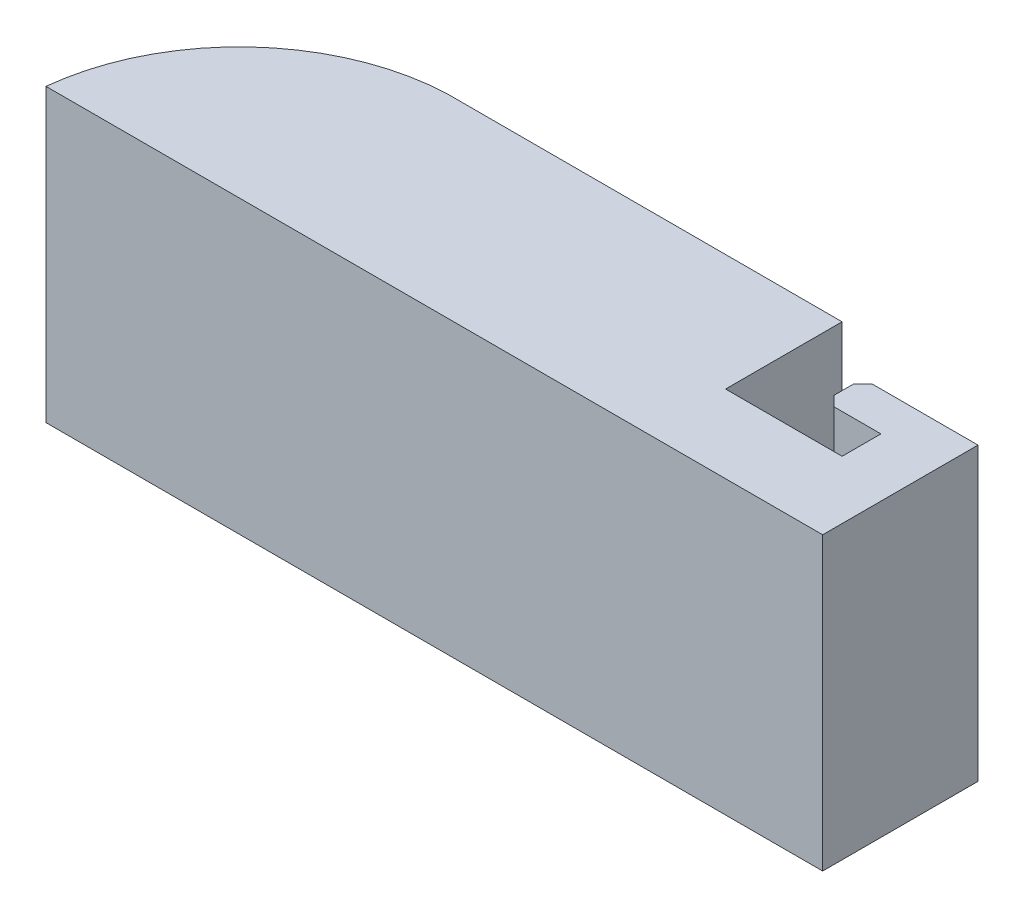
ISO-10303-21;
HEADER;
FILE_DESCRIPTION(('STEP AP214'),'2;1');
FILE_NAME('part.step','',(''),(''),'','','');
FILE_SCHEMA(('AUTOMOTIVE_DESIGN { 1 0 10303 214 1 1 1 1 }'));
ENDSEC;
DATA;
#1=APPLICATION_CONTEXT('core data for automotive mechanical design processes');
#2=APPLICATION_PROTOCOL_DEFINITION('international standard','automotive_design',2000,#1);
#3=PRODUCT_CONTEXT('',#1,'mechanical');
#4=PRODUCT('Part','Part','',(#3));
#5=PRODUCT_RELATED_PRODUCT_CATEGORY('part','',(#4));
#6=PRODUCT_DEFINITION_FORMATION('','',#4);
#7=PRODUCT_DEFINITION_CONTEXT('part definition',#1,'design');
#8=PRODUCT_DEFINITION('design','',#6,#7);
#9=PRODUCT_DEFINITION_SHAPE('','',#8);
#10=(LENGTH_UNIT() NAMED_UNIT(*) SI_UNIT(.MILLI.,.METRE.));
#11=(NAMED_UNIT(*) PLANE_ANGLE_UNIT() SI_UNIT($,.RADIAN.));
#12=(NAMED_UNIT(*) SI_UNIT($,.STERADIAN.) SOLID_ANGLE_UNIT());
#13=UNCERTAINTY_MEASURE_WITH_UNIT(LENGTH_MEASURE(1.E-05),#10,'distance_accuracy_value','');
#14=(GEOMETRIC_REPRESENTATION_CONTEXT(3) GLOBAL_UNCERTAINTY_ASSIGNED_CONTEXT((#13)) GLOBAL_UNIT_ASSIGNED_CONTEXT((#10,
#11,#12)) REPRESENTATION_CONTEXT('',''));
#15=CARTESIAN_POINT('',(0.,0.,0.));
#16=DIRECTION('',(0.,0.,1.));
#17=DIRECTION('',(1.,0.,0.));
#18=AXIS2_PLACEMENT_3D('',#15,#16,#17);
#19=CARTESIAN_POINT('',(0.,15.,0.));
#20=DIRECTION('',(0.,0.,-1.));
#21=DIRECTION('',(-1.,0.,0.));
#22=AXIS2_PLACEMENT_3D('',#19,#20,#21);
#23=PLANE('',#22);
#24=DIRECTION('',(1.,0.,0.));
#25=VECTOR('',#24,1.);
#26=CARTESIAN_POINT('',(0.,0.,0.));
#27=LINE('',#26,#25);
#28=CARTESIAN_POINT('',(0.,0.,0.));
#29=VERTEX_POINT('',#28);
#30=CARTESIAN_POINT('',(40.,0.,0.));
#31=VERTEX_POINT('',#30);
#32=EDGE_CURVE('E171',#29,#31,#27,.T.);
#33=ORIENTED_EDGE('',*,*,#32,.T.);
#34=DIRECTION('',(0.,-1.,0.));
#35=VECTOR('',#34,1.);
#36=CARTESIAN_POINT('',(40.,15.,0.));
#37=LINE('',#36,#35);
#38=CARTESIAN_POINT('',(40.,15.,0.));
#39=VERTEX_POINT('',#38);
#40=EDGE_CURVE('E175',#39,#31,#37,.T.);
#41=ORIENTED_EDGE('',*,*,#40,.F.);
#42=DIRECTION('',(1.,0.,0.));
#43=VECTOR('',#42,1.);
#44=CARTESIAN_POINT('',(0.,15.,0.));
#45=LINE('',#44,#43);
#46=CARTESIAN_POINT('',(0.,15.,0.));
#47=VERTEX_POINT('',#46);
#48=EDGE_CURVE('E163',#47,#39,#45,.T.);
#49=ORIENTED_EDGE('',*,*,#48,.F.);
#50=DIRECTION('',(0.,-1.,0.));
#51=VECTOR('',#50,1.);
#52=CARTESIAN_POINT('',(0.,15.,0.));
#53=LINE('',#52,#51);
#54=EDGE_CURVE('E179',#47,#29,#53,.T.);
#55=ORIENTED_EDGE('',*,*,#54,.T.);
#56=EDGE_LOOP('',(#33,#41,#49,#55));
#57=FACE_BOUND('',#56,.T.);
#58=ADVANCED_FACE('F41',(#57),#23,.F.);
#59=CARTESIAN_POINT('',(40.,15.,0.));
#60=DIRECTION('',(-1.,0.,0.));
#61=DIRECTION('',(0.,0.,1.));
#62=AXIS2_PLACEMENT_3D('',#59,#60,#61);
#63=PLANE('',#62);
#64=DIRECTION('',(0.,0.,-1.));
#65=VECTOR('',#64,1.);
#66=CARTESIAN_POINT('',(40.,0.,0.));
#67=LINE('',#66,#65);
#68=CARTESIAN_POINT('',(40.,0.,-8.));
#69=VERTEX_POINT('',#68);
#70=EDGE_CURVE('E164',#31,#69,#67,.T.);
#71=ORIENTED_EDGE('',*,*,#70,.T.);
#72=DIRECTION('',(0.,1.,0.));
#73=VECTOR('',#72,1.);
#74=CARTESIAN_POINT('',(40.,0.,-8.));
#75=LINE('',#74,#73);
#76=CARTESIAN_POINT('',(40.,15.,-8.));
#77=VERTEX_POINT('',#76);
#78=EDGE_CURVE('E213',#69,#77,#75,.T.);
#79=ORIENTED_EDGE('',*,*,#78,.T.);
#80=DIRECTION('',(0.,0.,-1.));
#81=VECTOR('',#80,1.);
#82=CARTESIAN_POINT('',(40.,15.,0.));
#83=LINE('',#82,#81);
#84=EDGE_CURVE('E168',#39,#77,#83,.T.);
#85=ORIENTED_EDGE('',*,*,#84,.F.);
#86=ORIENTED_EDGE('',*,*,#40,.T.);
#87=EDGE_LOOP('',(#71,#79,#85,#86));
#88=FACE_BOUND('',#87,.T.);
#89=ADVANCED_FACE('F262',(#88),#63,.F.);
#90=CARTESIAN_POINT('',(0.,15.,-10.));
#91=DIRECTION('',(0.,0.,1.));
#92=DIRECTION('',(1.,0.,0.));
#93=AXIS2_PLACEMENT_3D('',#90,#91,#92);
#94=PLANE('',#93);
#95=DIRECTION('',(-1.,0.,0.));
#96=VECTOR('',#95,1.);
#97=CARTESIAN_POINT('',(0.,15.,-10.));
#98=LINE('',#97,#96);
#99=CARTESIAN_POINT('',(31.,15.,-10.));
#100=VERTEX_POINT('',#99);
#101=CARTESIAN_POINT('',(10.6638408238679,15.,-10.));
#102=VERTEX_POINT('',#101);
#103=EDGE_CURVE('E154',#100,#102,#98,.T.);
#104=ORIENTED_EDGE('',*,*,#103,.F.);
#105=DIRECTION('',(0.,1.,0.));
#106=VECTOR('',#105,1.);
#107=CARTESIAN_POINT('',(31.,0.,-10.));
#108=LINE('',#107,#106);
#109=CARTESIAN_POINT('',(31.,0.,-10.));
#110=VERTEX_POINT('',#109);
#111=EDGE_CURVE('E138',#110,#100,#108,.T.);
#112=ORIENTED_EDGE('',*,*,#111,.F.);
#113=DIRECTION('',(-1.,0.,0.));
#114=VECTOR('',#113,1.);
#115=CARTESIAN_POINT('',(0.,0.,-10.));
#116=LINE('',#115,#114);
#117=CARTESIAN_POINT('',(10.6638408238679,0.,-10.));
#118=VERTEX_POINT('',#117);
#119=EDGE_CURVE('E152',#110,#118,#116,.T.);
#120=ORIENTED_EDGE('',*,*,#119,.T.);
#121=DIRECTION('',(0.,1.,0.));
#122=VECTOR('',#121,1.);
#123=CARTESIAN_POINT('',(10.6638408238679,0.,-10.));
#124=LINE('',#123,#122);
#125=EDGE_CURVE('E247',#118,#102,#124,.T.);
#126=ORIENTED_EDGE('',*,*,#125,.T.);
#127=EDGE_LOOP('',(#104,#112,#120,#126));
#128=FACE_BOUND('',#127,.T.);
#129=ADVANCED_FACE('F150',(#128),#94,.F.);
#130=CARTESIAN_POINT('',(0.,15.,0.));
#131=DIRECTION('',(0.,-1.,0.));
#132=DIRECTION('',(0.,0.,-1.));
#133=AXIS2_PLACEMENT_3D('',#130,#131,#132);
#134=PLANE('',#133);
#135=DIRECTION('',(1.,0.,0.));
#136=VECTOR('',#135,1.);
#137=CARTESIAN_POINT('',(34.0714996686127,15.,-8.));
#138=LINE('',#137,#136);
#139=CARTESIAN_POINT('',(34.5714996686127,15.,-8.));
#140=VERTEX_POINT('',#139);
#141=EDGE_CURVE('E146',#140,#77,#138,.T.);
#142=ORIENTED_EDGE('',*,*,#141,.F.);
#143=DIRECTION('',(0.707106781186548,0.,-0.707106781186548));
#144=VECTOR('',#143,1.);
#145=CARTESIAN_POINT('',(34.5714996686127,15.,-8.));
#146=LINE('',#145,#144);
#147=CARTESIAN_POINT('',(34.0714996686127,15.,-7.5));
#148=VERTEX_POINT('',#147);
#149=EDGE_CURVE('E190',#140,#148,#146,.F.);
#150=ORIENTED_EDGE('',*,*,#149,.T.);
#151=DIRECTION('',(0.,0.,-1.));
#152=VECTOR('',#151,1.);
#153=CARTESIAN_POINT('',(34.0714996686127,15.,-6.));
#154=LINE('',#153,#152);
#155=CARTESIAN_POINT('',(34.0714996686127,15.,-6.49999999999999));
#156=VERTEX_POINT('',#155);
#157=EDGE_CURVE('E220',#156,#148,#154,.T.);
#158=ORIENTED_EDGE('',*,*,#157,.F.);
#159=DIRECTION('',(-0.707106781186552,0.,-0.707106781186543));
#160=VECTOR('',#159,1.);
#161=CARTESIAN_POINT('',(34.0714996686127,15.,-6.49999999999999));
#162=LINE('',#161,#160);
#163=CARTESIAN_POINT('',(34.5714996686127,15.,-6.));
#164=VERTEX_POINT('',#163);
#165=EDGE_CURVE('E187',#156,#164,#162,.F.);
#166=ORIENTED_EDGE('',*,*,#165,.T.);
#167=DIRECTION('',(-1.,0.,0.));
#168=VECTOR('',#167,1.);
#169=CARTESIAN_POINT('',(37.,15.,-6.));
#170=LINE('',#169,#168);
#171=CARTESIAN_POINT('',(37.,15.,-6.));
#172=VERTEX_POINT('',#171);
#173=EDGE_CURVE('E225',#172,#164,#170,.T.);
#174=ORIENTED_EDGE('',*,*,#173,.F.);
#175=DIRECTION('',(0.,0.,-1.));
#176=VECTOR('',#175,1.);
#177=CARTESIAN_POINT('',(37.,15.,-4.));
#178=LINE('',#177,#176);
#179=CARTESIAN_POINT('',(37.,15.,-4.));
#180=VERTEX_POINT('',#179);
#181=EDGE_CURVE('E230',#180,#172,#178,.T.);
#182=ORIENTED_EDGE('',*,*,#181,.F.);
#183=DIRECTION('',(1.,0.,0.));
#184=VECTOR('',#183,1.);
#185=CARTESIAN_POINT('',(31.,15.,-4.));
#186=LINE('',#185,#184);
#187=CARTESIAN_POINT('',(31.,15.,-4.));
#188=VERTEX_POINT('',#187);
#189=EDGE_CURVE('E401',#188,#180,#186,.T.);
#190=ORIENTED_EDGE('',*,*,#189,.F.);
#191=DIRECTION('',(0.,0.,1.));
#192=VECTOR('',#191,1.);
#193=CARTESIAN_POINT('',(31.,15.,-10.));
#194=LINE('',#193,#192);
#195=EDGE_CURVE('E398',#100,#188,#194,.T.);
#196=ORIENTED_EDGE('',*,*,#195,.F.);
#197=ORIENTED_EDGE('',*,*,#103,.T.);
#198=CARTESIAN_POINT('',(11.1116441513497,15.,1.16340539630602));
#199=DIRECTION('',(0.,-1.,0.));
#200=DIRECTION('',(0.,0.,-1.));
#201=AXIS2_PLACEMENT_3D('',#198,#199,#200);
#202=CIRCLE('',#201,11.1723832668942);
#203=EDGE_CURVE('E236',#47,#102,#202,.T.);
#204=ORIENTED_EDGE('',*,*,#203,.F.);
#205=ORIENTED_EDGE('',*,*,#48,.T.);
#206=ORIENTED_EDGE('',*,*,#84,.T.);
#207=EDGE_LOOP('',(#142,#150,#158,#166,#174,#182,#190,#196,#197,#204,#205,#206));
#208=FACE_BOUND('',#207,.T.);
#209=ADVANCED_FACE('F219',(#208),#134,.F.);
#210=CARTESIAN_POINT('',(0.,0.,0.));
#211=DIRECTION('',(0.,-1.,0.));
#212=DIRECTION('',(0.,0.,-1.));
#213=AXIS2_PLACEMENT_3D('',#210,#211,#212);
#214=PLANE('',#213);
#215=DIRECTION('',(0.,0.,-1.));
#216=VECTOR('',#215,1.);
#217=CARTESIAN_POINT('',(34.0714996686127,0.,-6.));
#218=LINE('',#217,#216);
#219=CARTESIAN_POINT('',(34.0714996686127,0.,-6.49999999999999));
#220=VERTEX_POINT('',#219);
#221=CARTESIAN_POINT('',(34.0714996686127,0.,-7.5));
#222=VERTEX_POINT('',#221);
#223=EDGE_CURVE('E206',#220,#222,#218,.T.);
#224=ORIENTED_EDGE('',*,*,#223,.T.);
#225=DIRECTION('',(-0.707106781186548,0.,0.707106781186548));
#226=VECTOR('',#225,1.);
#227=CARTESIAN_POINT('',(13.2857498343064,0.,13.2857498343064));
#228=LINE('',#227,#226);
#229=CARTESIAN_POINT('',(34.5714996686127,0.,-8.));
#230=VERTEX_POINT('',#229);
#231=EDGE_CURVE('E51',#222,#230,#228,.F.);
#232=ORIENTED_EDGE('',*,*,#231,.T.);
#233=DIRECTION('',(1.,0.,0.));
#234=VECTOR('',#233,1.);
#235=CARTESIAN_POINT('',(34.0714996686127,0.,-8.));
#236=LINE('',#235,#234);
#237=EDGE_CURVE('E156',#230,#69,#236,.T.);
#238=ORIENTED_EDGE('',*,*,#237,.T.);
#239=ORIENTED_EDGE('',*,*,#70,.F.);
#240=ORIENTED_EDGE('',*,*,#32,.F.);
#241=CARTESIAN_POINT('',(11.1116441513497,0.,1.16340539630602));
#242=DIRECTION('',(0.,-1.,0.));
#243=DIRECTION('',(0.,0.,-1.));
#244=AXIS2_PLACEMENT_3D('',#241,#242,#243);
#245=CIRCLE('',#244,11.1723832668942);
#246=EDGE_CURVE('E161',#29,#118,#245,.T.);
#247=ORIENTED_EDGE('',*,*,#246,.T.);
#248=ORIENTED_EDGE('',*,*,#119,.F.);
#249=DIRECTION('',(0.,0.,1.));
#250=VECTOR('',#249,1.);
#251=CARTESIAN_POINT('',(31.,0.,-10.));
#252=LINE('',#251,#250);
#253=CARTESIAN_POINT('',(31.,0.,-4.));
#254=VERTEX_POINT('',#253);
#255=EDGE_CURVE('E134',#110,#254,#252,.T.);
#256=ORIENTED_EDGE('',*,*,#255,.T.);
#257=DIRECTION('',(1.,0.,0.));
#258=VECTOR('',#257,1.);
#259=CARTESIAN_POINT('',(31.,0.,-4.));
#260=LINE('',#259,#258);
#261=CARTESIAN_POINT('',(37.,0.,-4.));
#262=VERTEX_POINT('',#261);
#263=EDGE_CURVE('E145',#254,#262,#260,.T.);
#264=ORIENTED_EDGE('',*,*,#263,.T.);
#265=DIRECTION('',(0.,0.,-1.));
#266=VECTOR('',#265,1.);
#267=CARTESIAN_POINT('',(37.,0.,-4.));
#268=LINE('',#267,#266);
#269=CARTESIAN_POINT('',(37.,0.,-6.));
#270=VERTEX_POINT('',#269);
#271=EDGE_CURVE('E394',#262,#270,#268,.T.);
#272=ORIENTED_EDGE('',*,*,#271,.T.);
#273=DIRECTION('',(-1.,0.,0.));
#274=VECTOR('',#273,1.);
#275=CARTESIAN_POINT('',(37.,0.,-6.));
#276=LINE('',#275,#274);
#277=CARTESIAN_POINT('',(34.5714996686127,0.,-6.));
#278=VERTEX_POINT('',#277);
#279=EDGE_CURVE('E390',#270,#278,#276,.T.);
#280=ORIENTED_EDGE('',*,*,#279,.T.);
#281=DIRECTION('',(0.707106781186552,0.,0.707106781186543));
#282=VECTOR('',#281,1.);
#283=CARTESIAN_POINT('',(20.2857498343061,0.,-20.2857498343064));
#284=LINE('',#283,#282);
#285=EDGE_CURVE('E199',#278,#220,#284,.F.);
#286=ORIENTED_EDGE('',*,*,#285,.T.);
#287=EDGE_LOOP('',(#224,#232,#238,#239,#240,#247,#248,#256,#264,#272,#280,#286));
#288=FACE_BOUND('',#287,.T.);
#289=ADVANCED_FACE('F159',(#288),#214,.T.);
#290=CARTESIAN_POINT('',(11.1116441513497,0.,1.16340539630602));
#291=DIRECTION('',(0.,1.,0.));
#292=DIRECTION('',(0.,0.,1.));
#293=AXIS2_PLACEMENT_3D('',#290,#291,#292);
#294=CYLINDRICAL_SURFACE('',#293,11.1723832668942);
#295=ORIENTED_EDGE('',*,*,#203,.T.);
#296=ORIENTED_EDGE('',*,*,#125,.F.);
#297=ORIENTED_EDGE('',*,*,#246,.F.);
#298=ORIENTED_EDGE('',*,*,#54,.F.);
#299=EDGE_LOOP('',(#295,#296,#297,#298));
#300=FACE_BOUND('',#299,.T.);
#301=ADVANCED_FACE('F265',(#300),#294,.T.);
#302=CARTESIAN_POINT('',(34.0714996686127,0.,-8.));
#303=DIRECTION('',(0.,0.,1.));
#304=DIRECTION('',(1.,0.,0.));
#305=AXIS2_PLACEMENT_3D('',#302,#303,#304);
#306=PLANE('',#305);
#307=ORIENTED_EDGE('',*,*,#237,.F.);
#308=DIRECTION('',(0.,1.,0.));
#309=VECTOR('',#308,1.);
#310=CARTESIAN_POINT('',(34.5714996686127,0.,-8.));
#311=LINE('',#310,#309);
#312=EDGE_CURVE('E183',#230,#140,#311,.T.);
#313=ORIENTED_EDGE('',*,*,#312,.T.);
#314=ORIENTED_EDGE('',*,*,#141,.T.);
#315=ORIENTED_EDGE('',*,*,#78,.F.);
#316=EDGE_LOOP('',(#307,#313,#314,#315));
#317=FACE_BOUND('',#316,.T.);
#318=ADVANCED_FACE('F210',(#317),#306,.F.);
#319=CARTESIAN_POINT('',(34.0714996686127,0.,-6.));
#320=DIRECTION('',(1.,0.,0.));
#321=DIRECTION('',(0.,0.,-1.));
#322=AXIS2_PLACEMENT_3D('',#319,#320,#321);
#323=PLANE('',#322);
#324=ORIENTED_EDGE('',*,*,#157,.T.);
#325=DIRECTION('',(0.,-1.,0.));
#326=VECTOR('',#325,1.);
#327=CARTESIAN_POINT('',(34.0714996686127,0.,-7.5));
#328=LINE('',#327,#326);
#329=EDGE_CURVE('E64',#148,#222,#328,.T.);
#330=ORIENTED_EDGE('',*,*,#329,.T.);
#331=ORIENTED_EDGE('',*,*,#223,.F.);
#332=DIRECTION('',(0.,1.,0.));
#333=VECTOR('',#332,1.);
#334=CARTESIAN_POINT('',(34.0714996686127,0.,-6.49999999999999));
#335=LINE('',#334,#333);
#336=EDGE_CURVE('E193',#220,#156,#335,.T.);
#337=ORIENTED_EDGE('',*,*,#336,.T.);
#338=EDGE_LOOP('',(#324,#330,#331,#337));
#339=FACE_BOUND('',#338,.T.);
#340=ADVANCED_FACE('F222',(#339),#323,.F.);
#341=CARTESIAN_POINT('',(37.,0.,-6.));
#342=DIRECTION('',(0.,0.,-1.));
#343=DIRECTION('',(-1.,0.,0.));
#344=AXIS2_PLACEMENT_3D('',#341,#342,#343);
#345=PLANE('',#344);
#346=ORIENTED_EDGE('',*,*,#173,.T.);
#347=DIRECTION('',(0.,-1.,0.));
#348=VECTOR('',#347,1.);
#349=CARTESIAN_POINT('',(34.5714996686127,0.,-6.));
#350=LINE('',#349,#348);
#351=EDGE_CURVE('E11',#164,#278,#350,.T.);
#352=ORIENTED_EDGE('',*,*,#351,.T.);
#353=ORIENTED_EDGE('',*,*,#279,.F.);
#354=DIRECTION('',(0.,1.,0.));
#355=VECTOR('',#354,1.);
#356=CARTESIAN_POINT('',(37.,0.,-6.));
#357=LINE('',#356,#355);
#358=EDGE_CURVE('E237',#270,#172,#357,.T.);
#359=ORIENTED_EDGE('',*,*,#358,.T.);
#360=EDGE_LOOP('',(#346,#352,#353,#359));
#361=FACE_BOUND('',#360,.T.);
#362=ADVANCED_FACE('F302',(#361),#345,.F.);
#363=CARTESIAN_POINT('',(37.,0.,-4.));
#364=DIRECTION('',(1.,0.,0.));
#365=DIRECTION('',(0.,0.,-1.));
#366=AXIS2_PLACEMENT_3D('',#363,#364,#365);
#367=PLANE('',#366);
#368=ORIENTED_EDGE('',*,*,#181,.T.);
#369=ORIENTED_EDGE('',*,*,#358,.F.);
#370=ORIENTED_EDGE('',*,*,#271,.F.);
#371=DIRECTION('',(0.,1.,0.));
#372=VECTOR('',#371,1.);
#373=CARTESIAN_POINT('',(37.,0.,-4.));
#374=LINE('',#373,#372);
#375=EDGE_CURVE('E240',#262,#180,#374,.T.);
#376=ORIENTED_EDGE('',*,*,#375,.T.);
#377=EDGE_LOOP('',(#368,#369,#370,#376));
#378=FACE_BOUND('',#377,.T.);
#379=ADVANCED_FACE('F296',(#378),#367,.F.);
#380=CARTESIAN_POINT('',(31.,0.,-4.));
#381=DIRECTION('',(0.,0.,1.));
#382=DIRECTION('',(1.,0.,0.));
#383=AXIS2_PLACEMENT_3D('',#380,#381,#382);
#384=PLANE('',#383);
#385=ORIENTED_EDGE('',*,*,#189,.T.);
#386=ORIENTED_EDGE('',*,*,#375,.F.);
#387=ORIENTED_EDGE('',*,*,#263,.F.);
#388=DIRECTION('',(0.,1.,0.));
#389=VECTOR('',#388,1.);
#390=CARTESIAN_POINT('',(31.,0.,-4.));
#391=LINE('',#390,#389);
#392=EDGE_CURVE('E140',#254,#188,#391,.T.);
#393=ORIENTED_EDGE('',*,*,#392,.T.);
#394=EDGE_LOOP('',(#385,#386,#387,#393));
#395=FACE_BOUND('',#394,.T.);
#396=ADVANCED_FACE('F292',(#395),#384,.F.);
#397=CARTESIAN_POINT('',(31.,0.,-10.));
#398=DIRECTION('',(-1.,0.,0.));
#399=DIRECTION('',(0.,0.,1.));
#400=AXIS2_PLACEMENT_3D('',#397,#398,#399);
#401=PLANE('',#400);
#402=ORIENTED_EDGE('',*,*,#195,.T.);
#403=ORIENTED_EDGE('',*,*,#392,.F.);
#404=ORIENTED_EDGE('',*,*,#255,.F.);
#405=ORIENTED_EDGE('',*,*,#111,.T.);
#406=EDGE_LOOP('',(#402,#403,#404,#405));
#407=FACE_BOUND('',#406,.T.);
#408=ADVANCED_FACE('F137',(#407),#401,.F.);
#409=CARTESIAN_POINT('',(34.5714996686127,0.,-8.));
#410=DIRECTION('',(0.707106781186547,0.,0.707106781186547));
#411=DIRECTION('',(0.,1.,0.));
#412=AXIS2_PLACEMENT_3D('',#409,#410,#411);
#413=PLANE('',#412);
#414=ORIENTED_EDGE('',*,*,#231,.F.);
#415=ORIENTED_EDGE('',*,*,#329,.F.);
#416=ORIENTED_EDGE('',*,*,#149,.F.);
#417=ORIENTED_EDGE('',*,*,#312,.F.);
#418=EDGE_LOOP('',(#414,#415,#416,#417));
#419=FACE_BOUND('',#418,.T.);
#420=ADVANCED_FACE('F216',(#419),#413,.F.);
#421=CARTESIAN_POINT('',(34.0714996686127,0.,-6.49999999999999));
#422=DIRECTION('',(0.707106781186543,0.,-0.707106781186552));
#423=DIRECTION('',(0.,1.,0.));
#424=AXIS2_PLACEMENT_3D('',#421,#422,#423);
#425=PLANE('',#424);
#426=ORIENTED_EDGE('',*,*,#285,.F.);
#427=ORIENTED_EDGE('',*,*,#351,.F.);
#428=ORIENTED_EDGE('',*,*,#165,.F.);
#429=ORIENTED_EDGE('',*,*,#336,.F.);
#430=EDGE_LOOP('',(#426,#427,#428,#429));
#431=FACE_BOUND('',#430,.T.);
#432=ADVANCED_FACE('F44',(#431),#425,.F.);
#433=CLOSED_SHELL('',(#58,#89,#129,#209,#289,#301,#318,#340,#362,#379,#396,#408,#420,#432));
#434=MANIFOLD_SOLID_BREP('B2',#433);
#435=ADVANCED_BREP_SHAPE_REPRESENTATION('',(#18,#434),#14);
#436=SHAPE_DEFINITION_REPRESENTATION(#9,#435);
ENDSEC;
END-ISO-10303-21;
